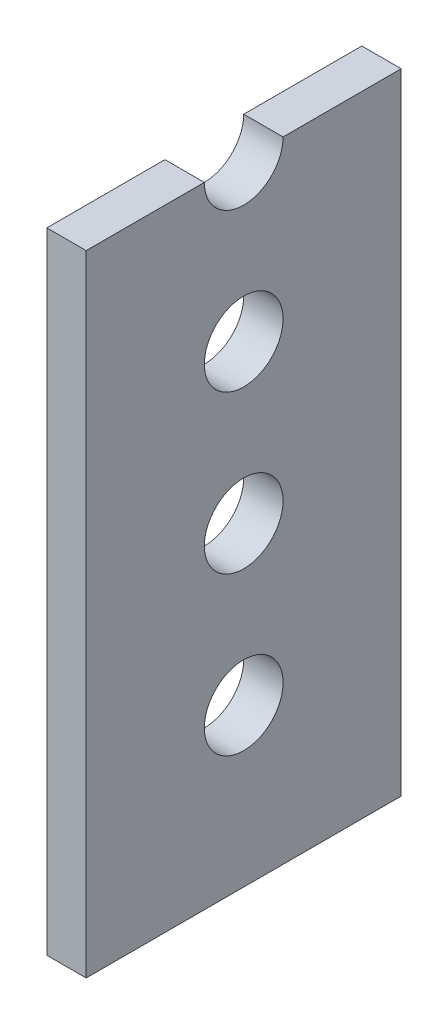
ISO-10303-21;
HEADER;
FILE_DESCRIPTION(('STEP AP214'),'2;1');
FILE_NAME('part.step','',(''),(''),'','','');
FILE_SCHEMA(('AUTOMOTIVE_DESIGN { 1 0 10303 214 1 1 1 1 }'));
ENDSEC;
DATA;
#1=APPLICATION_CONTEXT('core data for automotive mechanical design processes');
#2=APPLICATION_PROTOCOL_DEFINITION('international standard','automotive_design',2000,#1);
#3=PRODUCT_CONTEXT('',#1,'mechanical');
#4=PRODUCT('Part','Part','',(#3));
#5=PRODUCT_RELATED_PRODUCT_CATEGORY('part','',(#4));
#6=PRODUCT_DEFINITION_FORMATION('','',#4);
#7=PRODUCT_DEFINITION_CONTEXT('part definition',#1,'design');
#8=PRODUCT_DEFINITION('design','',#6,#7);
#9=PRODUCT_DEFINITION_SHAPE('','',#8);
#10=(LENGTH_UNIT() NAMED_UNIT(*) SI_UNIT(.MILLI.,.METRE.));
#11=(NAMED_UNIT(*) PLANE_ANGLE_UNIT() SI_UNIT($,.RADIAN.));
#12=(NAMED_UNIT(*) SI_UNIT($,.STERADIAN.) SOLID_ANGLE_UNIT());
#13=UNCERTAINTY_MEASURE_WITH_UNIT(LENGTH_MEASURE(1.E-05),#10,'distance_accuracy_value','');
#14=(GEOMETRIC_REPRESENTATION_CONTEXT(3) GLOBAL_UNCERTAINTY_ASSIGNED_CONTEXT((#13)) GLOBAL_UNIT_ASSIGNED_CONTEXT((#10,
#11,#12)) REPRESENTATION_CONTEXT('',''));
#15=CARTESIAN_POINT('',(0.,0.,0.));
#16=DIRECTION('',(0.,0.,1.));
#17=DIRECTION('',(1.,0.,0.));
#18=AXIS2_PLACEMENT_3D('',#15,#16,#17);
#19=CARTESIAN_POINT('',(3.175,0.,0.));
#20=DIRECTION('',(-1.,0.,0.));
#21=DIRECTION('',(0.,0.,1.));
#22=AXIS2_PLACEMENT_3D('',#19,#20,#21);
#23=PLANE('',#22);
#24=CARTESIAN_POINT('',(3.175,-685.8,0.));
#25=DIRECTION('',(1.,0.,0.));
#26=DIRECTION('',(0.,0.,-1.));
#27=AXIS2_PLACEMENT_3D('',#24,#25,#26);
#28=CIRCLE('',#27,3.175);
#29=CARTESIAN_POINT('',(3.175,-685.8,-3.175));
#30=VERTEX_POINT('',#29);
#31=EDGE_CURVE('E111',#30,#30,#28,.T.);
#32=ORIENTED_EDGE('',*,*,#31,.F.);
#33=EDGE_LOOP('',(#32));
#34=FACE_BOUND('',#33,.T.);
#35=CARTESIAN_POINT('',(3.175,-673.1,0.));
#36=DIRECTION('',(1.,0.,0.));
#37=DIRECTION('',(0.,0.,-1.));
#38=AXIS2_PLACEMENT_3D('',#35,#36,#37);
#39=CIRCLE('',#38,3.175);
#40=CARTESIAN_POINT('',(3.175,-673.1,-3.17499999999995));
#41=VERTEX_POINT('',#40);
#42=EDGE_CURVE('E144',#41,#41,#39,.T.);
#43=ORIENTED_EDGE('',*,*,#42,.F.);
#44=EDGE_LOOP('',(#43));
#45=FACE_BOUND('',#44,.T.);
#46=CARTESIAN_POINT('',(3.175,-660.4,0.));
#47=DIRECTION('',(1.,0.,0.));
#48=DIRECTION('',(0.,0.,-1.));
#49=AXIS2_PLACEMENT_3D('',#46,#47,#48);
#50=CIRCLE('',#49,3.175);
#51=CARTESIAN_POINT('',(3.175,-660.4,-3.17499999999991));
#52=VERTEX_POINT('',#51);
#53=EDGE_CURVE('E137',#52,#52,#50,.T.);
#54=ORIENTED_EDGE('',*,*,#53,.F.);
#55=EDGE_LOOP('',(#54));
#56=FACE_BOUND('',#55,.T.);
#57=DIRECTION('',(0.,1.,0.));
#58=VECTOR('',#57,1.);
#59=CARTESIAN_POINT('',(3.175,-698.500000000006,-12.7));
#60=LINE('',#59,#58);
#61=CARTESIAN_POINT('',(3.175,-698.500000000006,-12.7));
#62=VERTEX_POINT('',#61);
#63=CARTESIAN_POINT('',(3.175,-647.700000000006,-12.7));
#64=VERTEX_POINT('',#63);
#65=EDGE_CURVE('E108',#62,#64,#60,.T.);
#66=ORIENTED_EDGE('',*,*,#65,.T.);
#67=DIRECTION('',(0.,0.,1.));
#68=VECTOR('',#67,1.);
#69=CARTESIAN_POINT('',(3.175,-647.700000000006,0.));
#70=LINE('',#69,#68);
#71=CARTESIAN_POINT('',(3.175,-647.700000000006,-3.17499999999987));
#72=VERTEX_POINT('',#71);
#73=EDGE_CURVE('E122',#64,#72,#70,.T.);
#74=ORIENTED_EDGE('',*,*,#73,.T.);
#75=CARTESIAN_POINT('',(3.175,-647.7,1.33025439009923E-13));
#76=DIRECTION('',(1.,0.,0.));
#77=DIRECTION('',(0.,0.,-1.));
#78=AXIS2_PLACEMENT_3D('',#75,#76,#77);
#79=CIRCLE('',#78,3.175);
#80=CARTESIAN_POINT('',(3.175,-647.700000000006,3.17500000000013));
#81=VERTEX_POINT('',#80);
#82=EDGE_CURVE('E129',#81,#72,#79,.T.);
#83=ORIENTED_EDGE('',*,*,#82,.F.);
#84=CARTESIAN_POINT('',(3.175,-647.700000000006,12.6999999999998));
#85=VERTEX_POINT('',#84);
#86=EDGE_CURVE('E55',#81,#85,#70,.T.);
#87=ORIENTED_EDGE('',*,*,#86,.T.);
#88=DIRECTION('',(0.,-1.,0.));
#89=VECTOR('',#88,1.);
#90=CARTESIAN_POINT('',(3.175,-698.500000000006,12.7));
#91=LINE('',#90,#89);
#92=CARTESIAN_POINT('',(3.175,-698.500000000006,12.7));
#93=VERTEX_POINT('',#92);
#94=EDGE_CURVE('E98',#85,#93,#91,.T.);
#95=ORIENTED_EDGE('',*,*,#94,.T.);
#96=DIRECTION('',(0.,0.,-1.));
#97=VECTOR('',#96,1.);
#98=CARTESIAN_POINT('',(3.175,-698.500000000006,12.7));
#99=LINE('',#98,#97);
#100=EDGE_CURVE('E119',#93,#62,#99,.T.);
#101=ORIENTED_EDGE('',*,*,#100,.T.);
#102=EDGE_LOOP('',(#66,#74,#83,#87,#95,#101));
#103=FACE_BOUND('',#102,.T.);
#104=ADVANCED_FACE('F33',(#34,#45,#56,#103),#23,.F.);
#105=CARTESIAN_POINT('',(0.,0.,0.));
#106=DIRECTION('',(-1.,0.,0.));
#107=DIRECTION('',(0.,0.,1.));
#108=AXIS2_PLACEMENT_3D('',#105,#106,#107);
#109=PLANE('',#108);
#110=DIRECTION('',(0.,0.,-1.));
#111=VECTOR('',#110,1.);
#112=CARTESIAN_POINT('',(0.,-647.700000000006,12.6999999999998));
#113=LINE('',#112,#111);
#114=CARTESIAN_POINT('',(0.,-647.700000000006,-3.17499999999987));
#115=VERTEX_POINT('',#114);
#116=CARTESIAN_POINT('',(0.,-647.700000000006,-12.7));
#117=VERTEX_POINT('',#116);
#118=EDGE_CURVE('E48',#115,#117,#113,.T.);
#119=ORIENTED_EDGE('',*,*,#118,.T.);
#120=DIRECTION('',(0.,1.,0.));
#121=VECTOR('',#120,1.);
#122=CARTESIAN_POINT('',(0.,-698.500000000006,-12.7));
#123=LINE('',#122,#121);
#124=CARTESIAN_POINT('',(0.,-698.500000000006,-12.7));
#125=VERTEX_POINT('',#124);
#126=EDGE_CURVE('E106',#125,#117,#123,.T.);
#127=ORIENTED_EDGE('',*,*,#126,.F.);
#128=DIRECTION('',(0.,0.,-1.));
#129=VECTOR('',#128,1.);
#130=CARTESIAN_POINT('',(0.,-698.500000000006,12.7));
#131=LINE('',#130,#129);
#132=CARTESIAN_POINT('',(0.,-698.500000000006,12.7));
#133=VERTEX_POINT('',#132);
#134=EDGE_CURVE('E105',#133,#125,#131,.T.);
#135=ORIENTED_EDGE('',*,*,#134,.F.);
#136=DIRECTION('',(0.,-1.,0.));
#137=VECTOR('',#136,1.);
#138=CARTESIAN_POINT('',(0.,-698.500000000006,12.7));
#139=LINE('',#138,#137);
#140=CARTESIAN_POINT('',(0.,-647.700000000006,12.6999999999998));
#141=VERTEX_POINT('',#140);
#142=EDGE_CURVE('E96',#141,#133,#139,.T.);
#143=ORIENTED_EDGE('',*,*,#142,.F.);
#144=CARTESIAN_POINT('',(0.,-647.700000000006,3.17500000000013));
#145=VERTEX_POINT('',#144);
#146=EDGE_CURVE('E83',#141,#145,#113,.T.);
#147=ORIENTED_EDGE('',*,*,#146,.T.);
#148=CARTESIAN_POINT('',(0.,-647.7,1.33025439009923E-13));
#149=DIRECTION('',(1.,0.,0.));
#150=DIRECTION('',(0.,0.,-1.));
#151=AXIS2_PLACEMENT_3D('',#148,#149,#150);
#152=CIRCLE('',#151,3.175);
#153=EDGE_CURVE('E134',#145,#115,#152,.T.);
#154=ORIENTED_EDGE('',*,*,#153,.T.);
#155=EDGE_LOOP('',(#119,#127,#135,#143,#147,#154));
#156=FACE_BOUND('',#155,.T.);
#157=CARTESIAN_POINT('',(0.,-673.1,0.));
#158=DIRECTION('',(1.,0.,0.));
#159=DIRECTION('',(0.,0.,-1.));
#160=AXIS2_PLACEMENT_3D('',#157,#158,#159);
#161=CIRCLE('',#160,3.175);
#162=CARTESIAN_POINT('',(0.,-673.1,-3.17499999999995));
#163=VERTEX_POINT('',#162);
#164=EDGE_CURVE('E142',#163,#163,#161,.T.);
#165=ORIENTED_EDGE('',*,*,#164,.T.);
#166=EDGE_LOOP('',(#165));
#167=FACE_BOUND('',#166,.T.);
#168=CARTESIAN_POINT('',(0.,-685.8,0.));
#169=DIRECTION('',(1.,0.,0.));
#170=DIRECTION('',(0.,0.,-1.));
#171=AXIS2_PLACEMENT_3D('',#168,#169,#170);
#172=CIRCLE('',#171,3.175);
#173=CARTESIAN_POINT('',(0.,-685.8,-3.175));
#174=VERTEX_POINT('',#173);
#175=EDGE_CURVE('E147',#174,#174,#172,.T.);
#176=ORIENTED_EDGE('',*,*,#175,.T.);
#177=EDGE_LOOP('',(#176));
#178=FACE_BOUND('',#177,.T.);
#179=CARTESIAN_POINT('',(0.,-660.4,0.));
#180=DIRECTION('',(1.,0.,0.));
#181=DIRECTION('',(0.,0.,-1.));
#182=AXIS2_PLACEMENT_3D('',#179,#180,#181);
#183=CIRCLE('',#182,3.175);
#184=CARTESIAN_POINT('',(0.,-660.4,-3.17499999999991));
#185=VERTEX_POINT('',#184);
#186=EDGE_CURVE('E133',#185,#185,#183,.T.);
#187=ORIENTED_EDGE('',*,*,#186,.T.);
#188=EDGE_LOOP('',(#187));
#189=FACE_BOUND('',#188,.T.);
#190=ADVANCED_FACE('F102',(#156,#167,#178,#189),#109,.T.);
#191=CARTESIAN_POINT('',(3.175,-698.500000000006,-12.7));
#192=DIRECTION('',(0.,0.,1.));
#193=DIRECTION('',(1.,0.,0.));
#194=AXIS2_PLACEMENT_3D('',#191,#192,#193);
#195=PLANE('',#194);
#196=ORIENTED_EDGE('',*,*,#126,.T.);
#197=DIRECTION('',(1.,0.,0.));
#198=VECTOR('',#197,1.);
#199=CARTESIAN_POINT('',(0.,-647.700000000006,-12.7));
#200=LINE('',#199,#198);
#201=EDGE_CURVE('E99',#117,#64,#200,.T.);
#202=ORIENTED_EDGE('',*,*,#201,.T.);
#203=ORIENTED_EDGE('',*,*,#65,.F.);
#204=DIRECTION('',(-1.,0.,0.));
#205=VECTOR('',#204,1.);
#206=CARTESIAN_POINT('',(3.175,-698.500000000006,-12.7));
#207=LINE('',#206,#205);
#208=EDGE_CURVE('E115',#62,#125,#207,.T.);
#209=ORIENTED_EDGE('',*,*,#208,.T.);
#210=EDGE_LOOP('',(#196,#202,#203,#209));
#211=FACE_BOUND('',#210,.T.);
#212=ADVANCED_FACE('F35',(#211),#195,.F.);
#213=CARTESIAN_POINT('',(3.175,-698.500000000006,12.7));
#214=DIRECTION('',(0.,0.,-1.));
#215=DIRECTION('',(-1.,0.,0.));
#216=AXIS2_PLACEMENT_3D('',#213,#214,#215);
#217=PLANE('',#216);
#218=ORIENTED_EDGE('',*,*,#94,.F.);
#219=DIRECTION('',(1.,0.,0.));
#220=VECTOR('',#219,1.);
#221=CARTESIAN_POINT('',(0.,-647.700000000006,12.6999999999998));
#222=LINE('',#221,#220);
#223=EDGE_CURVE('E86',#141,#85,#222,.T.);
#224=ORIENTED_EDGE('',*,*,#223,.F.);
#225=ORIENTED_EDGE('',*,*,#142,.T.);
#226=DIRECTION('',(-1.,0.,0.));
#227=VECTOR('',#226,1.);
#228=CARTESIAN_POINT('',(3.175,-698.500000000006,12.7));
#229=LINE('',#228,#227);
#230=EDGE_CURVE('E118',#93,#133,#229,.T.);
#231=ORIENTED_EDGE('',*,*,#230,.F.);
#232=EDGE_LOOP('',(#218,#224,#225,#231));
#233=FACE_BOUND('',#232,.T.);
#234=ADVANCED_FACE('F94',(#233),#217,.F.);
#235=CARTESIAN_POINT('',(3.175,-698.500000000006,12.7));
#236=DIRECTION('',(0.,1.,0.));
#237=DIRECTION('',(0.,0.,1.));
#238=AXIS2_PLACEMENT_3D('',#235,#236,#237);
#239=PLANE('',#238);
#240=ORIENTED_EDGE('',*,*,#134,.T.);
#241=ORIENTED_EDGE('',*,*,#208,.F.);
#242=ORIENTED_EDGE('',*,*,#100,.F.);
#243=ORIENTED_EDGE('',*,*,#230,.T.);
#244=EDGE_LOOP('',(#240,#241,#242,#243));
#245=FACE_BOUND('',#244,.T.);
#246=ADVANCED_FACE('F158',(#245),#239,.F.);
#247=CARTESIAN_POINT('',(3.175,-685.8,0.));
#248=DIRECTION('',(-1.,0.,0.));
#249=DIRECTION('',(0.,0.,1.));
#250=AXIS2_PLACEMENT_3D('',#247,#248,#249);
#251=CYLINDRICAL_SURFACE('',#250,3.175);
#252=ORIENTED_EDGE('',*,*,#31,.T.);
#253=EDGE_LOOP('',(#252));
#254=FACE_BOUND('',#253,.T.);
#255=ORIENTED_EDGE('',*,*,#175,.F.);
#256=EDGE_LOOP('',(#255));
#257=FACE_BOUND('',#256,.T.);
#258=ADVANCED_FACE('F176',(#254,#257),#251,.F.);
#259=CARTESIAN_POINT('',(3.175,-673.1,0.));
#260=DIRECTION('',(-1.,0.,0.));
#261=DIRECTION('',(0.,0.,1.));
#262=AXIS2_PLACEMENT_3D('',#259,#260,#261);
#263=CYLINDRICAL_SURFACE('',#262,3.175);
#264=ORIENTED_EDGE('',*,*,#42,.T.);
#265=EDGE_LOOP('',(#264));
#266=FACE_BOUND('',#265,.T.);
#267=ORIENTED_EDGE('',*,*,#164,.F.);
#268=EDGE_LOOP('',(#267));
#269=FACE_BOUND('',#268,.T.);
#270=ADVANCED_FACE('F184',(#266,#269),#263,.F.);
#271=CARTESIAN_POINT('',(3.175,-660.4,0.));
#272=DIRECTION('',(-1.,0.,0.));
#273=DIRECTION('',(0.,0.,1.));
#274=AXIS2_PLACEMENT_3D('',#271,#272,#273);
#275=CYLINDRICAL_SURFACE('',#274,3.175);
#276=ORIENTED_EDGE('',*,*,#53,.T.);
#277=EDGE_LOOP('',(#276));
#278=FACE_BOUND('',#277,.T.);
#279=ORIENTED_EDGE('',*,*,#186,.F.);
#280=EDGE_LOOP('',(#279));
#281=FACE_BOUND('',#280,.T.);
#282=ADVANCED_FACE('F189',(#278,#281),#275,.F.);
#283=CARTESIAN_POINT('',(3.175,-647.7,1.33025439009923E-13));
#284=DIRECTION('',(-1.,0.,0.));
#285=DIRECTION('',(0.,0.,1.));
#286=AXIS2_PLACEMENT_3D('',#283,#284,#285);
#287=CYLINDRICAL_SURFACE('',#286,3.175);
#288=DIRECTION('',(-1.,0.,0.));
#289=VECTOR('',#288,1.);
#290=CARTESIAN_POINT('',(3.175,-647.700000000006,3.17500000000013));
#291=LINE('',#290,#289);
#292=EDGE_CURVE('E11',#81,#145,#291,.T.);
#293=ORIENTED_EDGE('',*,*,#292,.F.);
#294=ORIENTED_EDGE('',*,*,#82,.T.);
#295=DIRECTION('',(-1.,0.,0.));
#296=VECTOR('',#295,1.);
#297=CARTESIAN_POINT('',(3.175,-647.700000000006,-3.17499999999987));
#298=LINE('',#297,#296);
#299=EDGE_CURVE('E41',#115,#72,#298,.F.);
#300=ORIENTED_EDGE('',*,*,#299,.F.);
#301=ORIENTED_EDGE('',*,*,#153,.F.);
#302=EDGE_LOOP('',(#293,#294,#300,#301));
#303=FACE_BOUND('',#302,.T.);
#304=ADVANCED_FACE('F132',(#303),#287,.F.);
#305=CARTESIAN_POINT('',(0.,-647.700000000006,12.6999999999998));
#306=DIRECTION('',(0.,-1.,0.));
#307=DIRECTION('',(0.,0.,-1.));
#308=AXIS2_PLACEMENT_3D('',#305,#306,#307);
#309=PLANE('',#308);
#310=ORIENTED_EDGE('',*,*,#201,.F.);
#311=ORIENTED_EDGE('',*,*,#118,.F.);
#312=ORIENTED_EDGE('',*,*,#299,.T.);
#313=ORIENTED_EDGE('',*,*,#73,.F.);
#314=EDGE_LOOP('',(#310,#311,#312,#313));
#315=FACE_BOUND('',#314,.T.);
#316=ADVANCED_FACE('F121',(#315),#309,.F.);
#317=ORIENTED_EDGE('',*,*,#292,.T.);
#318=ORIENTED_EDGE('',*,*,#146,.F.);
#319=ORIENTED_EDGE('',*,*,#223,.T.);
#320=ORIENTED_EDGE('',*,*,#86,.F.);
#321=EDGE_LOOP('',(#317,#318,#319,#320));
#322=FACE_BOUND('',#321,.T.);
#323=ADVANCED_FACE('F85',(#322),#309,.F.);
#324=CLOSED_SHELL('',(#104,#190,#212,#234,#246,#258,#270,#282,#304,#316,#323));
#325=MANIFOLD_SOLID_BREP('B2',#324);
#326=ADVANCED_BREP_SHAPE_REPRESENTATION('',(#18,#325),#14);
#327=SHAPE_DEFINITION_REPRESENTATION(#9,#326);
ENDSEC;
END-ISO-10303-21;
